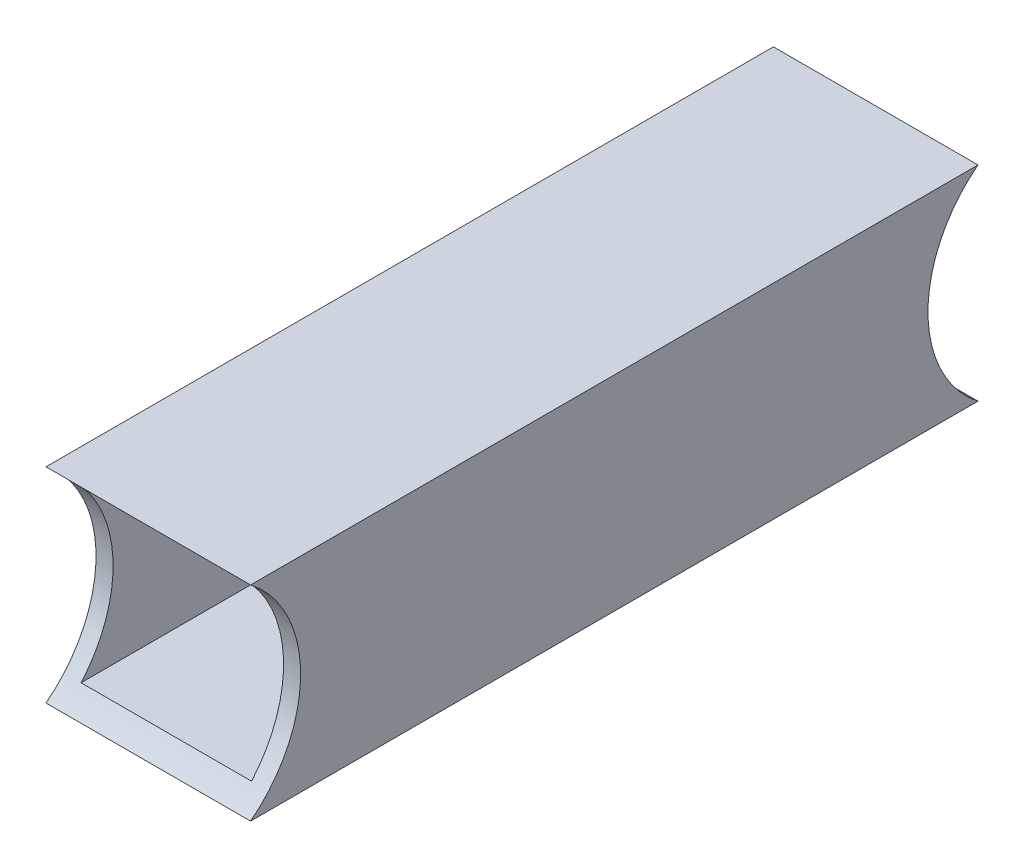
ISO-10303-21;
HEADER;
FILE_DESCRIPTION(('STEP AP214'),'2;1');
FILE_NAME('part.step','',(''),(''),'','','');
FILE_SCHEMA(('AUTOMOTIVE_DESIGN { 1 0 10303 214 1 1 1 1 }'));
ENDSEC;
DATA;
#1=APPLICATION_CONTEXT('core data for automotive mechanical design processes');
#2=APPLICATION_PROTOCOL_DEFINITION('international standard','automotive_design',2000,#1);
#3=PRODUCT_CONTEXT('',#1,'mechanical');
#4=PRODUCT('Part','Part','',(#3));
#5=PRODUCT_RELATED_PRODUCT_CATEGORY('part','',(#4));
#6=PRODUCT_DEFINITION_FORMATION('','',#4);
#7=PRODUCT_DEFINITION_CONTEXT('part definition',#1,'design');
#8=PRODUCT_DEFINITION('design','',#6,#7);
#9=PRODUCT_DEFINITION_SHAPE('','',#8);
#10=(LENGTH_UNIT() NAMED_UNIT(*) SI_UNIT(.MILLI.,.METRE.));
#11=(NAMED_UNIT(*) PLANE_ANGLE_UNIT() SI_UNIT($,.RADIAN.));
#12=(NAMED_UNIT(*) SI_UNIT($,.STERADIAN.) SOLID_ANGLE_UNIT());
#13=UNCERTAINTY_MEASURE_WITH_UNIT(LENGTH_MEASURE(1.E-05),#10,'distance_accuracy_value','');
#14=(GEOMETRIC_REPRESENTATION_CONTEXT(3) GLOBAL_UNCERTAINTY_ASSIGNED_CONTEXT((#13)) GLOBAL_UNIT_ASSIGNED_CONTEXT((#10,
#11,#12)) REPRESENTATION_CONTEXT('',''));
#15=CARTESIAN_POINT('',(0.,0.,0.));
#16=DIRECTION('',(0.,0.,1.));
#17=DIRECTION('',(1.,0.,0.));
#18=AXIS2_PLACEMENT_3D('',#15,#16,#17);
#19=CARTESIAN_POINT('',(38.1,19.05,-165.1));
#20=DIRECTION('',(-1.,0.,0.));
#21=DIRECTION('',(0.,0.,1.));
#22=AXIS2_PLACEMENT_3D('',#19,#20,#21);
#23=CYLINDRICAL_SURFACE('',#22,24.13);
#24=DIRECTION('',(-1.,0.,0.));
#25=VECTOR('',#24,1.);
#26=CARTESIAN_POINT('',(38.1,34.925,-146.927458213007));
#27=LINE('',#26,#25);
#28=CARTESIAN_POINT('',(3.175,34.925,-146.927458213007));
#29=VERTEX_POINT('',#28);
#30=CARTESIAN_POINT('',(34.925,34.925,-146.927458213007));
#31=VERTEX_POINT('',#30);
#32=EDGE_CURVE('E106',#29,#31,#27,.F.);
#33=ORIENTED_EDGE('',*,*,#32,.F.);
#34=CARTESIAN_POINT('',(3.175,19.05,-165.1));
#35=DIRECTION('',(-1.,0.,0.));
#36=DIRECTION('',(0.,0.,1.));
#37=AXIS2_PLACEMENT_3D('',#34,#35,#36);
#38=CIRCLE('',#37,24.13);
#39=CARTESIAN_POINT('',(3.175,3.175,-146.927458213007));
#40=VERTEX_POINT('',#39);
#41=EDGE_CURVE('E95',#40,#29,#38,.T.);
#42=ORIENTED_EDGE('',*,*,#41,.F.);
#43=DIRECTION('',(-1.,0.,0.));
#44=VECTOR('',#43,1.);
#45=CARTESIAN_POINT('',(38.1,3.175,-146.927458213007));
#46=LINE('',#45,#44);
#47=CARTESIAN_POINT('',(34.925,3.175,-146.927458213007));
#48=VERTEX_POINT('',#47);
#49=EDGE_CURVE('E100',#48,#40,#46,.T.);
#50=ORIENTED_EDGE('',*,*,#49,.F.);
#51=CARTESIAN_POINT('',(34.925,19.05,-165.1));
#52=DIRECTION('',(1.,0.,0.));
#53=DIRECTION('',(0.,0.,-1.));
#54=AXIS2_PLACEMENT_3D('',#51,#52,#53);
#55=CIRCLE('',#54,24.13);
#56=EDGE_CURVE('E113',#31,#48,#55,.T.);
#57=ORIENTED_EDGE('',*,*,#56,.F.);
#58=EDGE_LOOP('',(#33,#42,#50,#57));
#59=FACE_BOUND('',#58,.T.);
#60=CARTESIAN_POINT('',(0.,19.05,-165.1));
#61=DIRECTION('',(1.,0.,0.));
#62=DIRECTION('',(0.,0.,-1.));
#63=AXIS2_PLACEMENT_3D('',#60,#61,#62);
#64=CIRCLE('',#63,24.13);
#65=CARTESIAN_POINT('',(0.,38.1,-150.289382187093));
#66=VERTEX_POINT('',#65);
#67=CARTESIAN_POINT('',(0.,0.,-150.289382187093));
#68=VERTEX_POINT('',#67);
#69=EDGE_CURVE('E114',#66,#68,#64,.T.);
#70=ORIENTED_EDGE('',*,*,#69,.F.);
#71=DIRECTION('',(-1.,0.,0.));
#72=VECTOR('',#71,1.);
#73=CARTESIAN_POINT('',(38.1,38.1,-150.289382187093));
#74=LINE('',#73,#72);
#75=CARTESIAN_POINT('',(38.1,38.1,-150.289382187093));
#76=VERTEX_POINT('',#75);
#77=EDGE_CURVE('E147',#76,#66,#74,.T.);
#78=ORIENTED_EDGE('',*,*,#77,.F.);
#79=CARTESIAN_POINT('',(38.1,19.05,-165.1));
#80=DIRECTION('',(1.,0.,0.));
#81=DIRECTION('',(0.,0.,-1.));
#82=AXIS2_PLACEMENT_3D('',#79,#80,#81);
#83=CIRCLE('',#82,24.13);
#84=CARTESIAN_POINT('',(38.1,0.,-150.289382187093));
#85=VERTEX_POINT('',#84);
#86=EDGE_CURVE('E122',#76,#85,#83,.T.);
#87=ORIENTED_EDGE('',*,*,#86,.T.);
#88=DIRECTION('',(-1.,0.,0.));
#89=VECTOR('',#88,1.);
#90=CARTESIAN_POINT('',(38.1,0.,-150.289382187093));
#91=LINE('',#90,#89);
#92=EDGE_CURVE('E133',#85,#68,#91,.T.);
#93=ORIENTED_EDGE('',*,*,#92,.T.);
#94=EDGE_LOOP('',(#70,#78,#87,#93));
#95=FACE_BOUND('',#94,.T.);
#96=ADVANCED_FACE('F35',(#59,#95),#23,.F.);
#97=CARTESIAN_POINT('',(38.1,38.1,0.));
#98=DIRECTION('',(0.,1.,0.));
#99=DIRECTION('',(0.,0.,1.));
#100=AXIS2_PLACEMENT_3D('',#97,#98,#99);
#101=PLANE('',#100);
#102=DIRECTION('',(0.,0.,-1.));
#103=VECTOR('',#102,1.);
#104=CARTESIAN_POINT('',(0.,38.1,0.));
#105=LINE('',#104,#103);
#106=CARTESIAN_POINT('',(0.,38.1,-14.8106178129071));
#107=VERTEX_POINT('',#106);
#108=EDGE_CURVE('E117',#107,#66,#105,.T.);
#109=ORIENTED_EDGE('',*,*,#108,.F.);
#110=DIRECTION('',(-1.,0.,0.));
#111=VECTOR('',#110,1.);
#112=CARTESIAN_POINT('',(38.1,38.1,-14.8106178129071));
#113=LINE('',#112,#111);
#114=CARTESIAN_POINT('',(38.1,38.1,-14.8106178129071));
#115=VERTEX_POINT('',#114);
#116=EDGE_CURVE('E145',#115,#107,#113,.T.);
#117=ORIENTED_EDGE('',*,*,#116,.F.);
#118=DIRECTION('',(0.,0.,-1.));
#119=VECTOR('',#118,1.);
#120=CARTESIAN_POINT('',(38.1,38.1,0.));
#121=LINE('',#120,#119);
#122=EDGE_CURVE('E125',#115,#76,#121,.T.);
#123=ORIENTED_EDGE('',*,*,#122,.T.);
#124=ORIENTED_EDGE('',*,*,#77,.T.);
#125=EDGE_LOOP('',(#109,#117,#123,#124));
#126=FACE_BOUND('',#125,.T.);
#127=ADVANCED_FACE('F176',(#126),#101,.T.);
#128=CARTESIAN_POINT('',(38.1,19.05,0.));
#129=DIRECTION('',(-1.,0.,0.));
#130=DIRECTION('',(0.,0.,1.));
#131=AXIS2_PLACEMENT_3D('',#128,#129,#130);
#132=CYLINDRICAL_SURFACE('',#131,24.13);
#133=DIRECTION('',(-1.,0.,0.));
#134=VECTOR('',#133,1.);
#135=CARTESIAN_POINT('',(38.1,34.925,-18.1725417869928));
#136=LINE('',#135,#134);
#137=CARTESIAN_POINT('',(34.925,34.925,-18.1725417869928));
#138=VERTEX_POINT('',#137);
#139=CARTESIAN_POINT('',(3.175,34.925,-18.1725417869928));
#140=VERTEX_POINT('',#139);
#141=EDGE_CURVE('E11',#138,#140,#136,.T.);
#142=ORIENTED_EDGE('',*,*,#141,.F.);
#143=CARTESIAN_POINT('',(34.925,19.05,0.));
#144=DIRECTION('',(1.,0.,0.));
#145=DIRECTION('',(0.,0.,-1.));
#146=AXIS2_PLACEMENT_3D('',#143,#144,#145);
#147=CIRCLE('',#146,24.13);
#148=CARTESIAN_POINT('',(34.925,3.175,-18.1725417869928));
#149=VERTEX_POINT('',#148);
#150=EDGE_CURVE('E42',#149,#138,#147,.T.);
#151=ORIENTED_EDGE('',*,*,#150,.F.);
#152=DIRECTION('',(-1.,0.,0.));
#153=VECTOR('',#152,1.);
#154=CARTESIAN_POINT('',(38.1,3.175,-18.1725417869928));
#155=LINE('',#154,#153);
#156=CARTESIAN_POINT('',(3.175,3.175,-18.1725417869928));
#157=VERTEX_POINT('',#156);
#158=EDGE_CURVE('E151',#157,#149,#155,.F.);
#159=ORIENTED_EDGE('',*,*,#158,.F.);
#160=CARTESIAN_POINT('',(3.175,19.05,0.));
#161=DIRECTION('',(-1.,0.,0.));
#162=DIRECTION('',(0.,0.,1.));
#163=AXIS2_PLACEMENT_3D('',#160,#161,#162);
#164=CIRCLE('',#163,24.13);
#165=EDGE_CURVE('E149',#140,#157,#164,.T.);
#166=ORIENTED_EDGE('',*,*,#165,.F.);
#167=EDGE_LOOP('',(#142,#151,#159,#166));
#168=FACE_BOUND('',#167,.T.);
#169=CARTESIAN_POINT('',(0.,19.05,0.));
#170=DIRECTION('',(1.,0.,0.));
#171=DIRECTION('',(0.,0.,-1.));
#172=AXIS2_PLACEMENT_3D('',#169,#170,#171);
#173=CIRCLE('',#172,24.13);
#174=CARTESIAN_POINT('',(0.,0.,-14.8106178129071));
#175=VERTEX_POINT('',#174);
#176=EDGE_CURVE('E137',#175,#107,#173,.T.);
#177=ORIENTED_EDGE('',*,*,#176,.F.);
#178=DIRECTION('',(-1.,0.,0.));
#179=VECTOR('',#178,1.);
#180=CARTESIAN_POINT('',(38.1,0.,-14.8106178129071));
#181=LINE('',#180,#179);
#182=CARTESIAN_POINT('',(38.1,0.,-14.8106178129071));
#183=VERTEX_POINT('',#182);
#184=EDGE_CURVE('E143',#183,#175,#181,.T.);
#185=ORIENTED_EDGE('',*,*,#184,.F.);
#186=CARTESIAN_POINT('',(38.1,19.05,0.));
#187=DIRECTION('',(1.,0.,0.));
#188=DIRECTION('',(0.,0.,-1.));
#189=AXIS2_PLACEMENT_3D('',#186,#187,#188);
#190=CIRCLE('',#189,24.13);
#191=EDGE_CURVE('E129',#183,#115,#190,.T.);
#192=ORIENTED_EDGE('',*,*,#191,.T.);
#193=ORIENTED_EDGE('',*,*,#116,.T.);
#194=EDGE_LOOP('',(#177,#185,#192,#193));
#195=FACE_BOUND('',#194,.T.);
#196=ADVANCED_FACE('F161',(#168,#195),#132,.F.);
#197=CARTESIAN_POINT('',(38.1,0.,0.));
#198=DIRECTION('',(0.,1.,0.));
#199=DIRECTION('',(0.,0.,1.));
#200=AXIS2_PLACEMENT_3D('',#197,#198,#199);
#201=PLANE('',#200);
#202=DIRECTION('',(0.,0.,-1.));
#203=VECTOR('',#202,1.);
#204=CARTESIAN_POINT('',(0.,0.,0.));
#205=LINE('',#204,#203);
#206=EDGE_CURVE('E126',#175,#68,#205,.T.);
#207=ORIENTED_EDGE('',*,*,#206,.T.);
#208=ORIENTED_EDGE('',*,*,#92,.F.);
#209=DIRECTION('',(0.,0.,-1.));
#210=VECTOR('',#209,1.);
#211=CARTESIAN_POINT('',(38.1,0.,0.));
#212=LINE('',#211,#210);
#213=EDGE_CURVE('E132',#183,#85,#212,.T.);
#214=ORIENTED_EDGE('',*,*,#213,.F.);
#215=ORIENTED_EDGE('',*,*,#184,.T.);
#216=EDGE_LOOP('',(#207,#208,#214,#215));
#217=FACE_BOUND('',#216,.T.);
#218=ADVANCED_FACE('F184',(#217),#201,.F.);
#219=CARTESIAN_POINT('',(38.1,0.,0.));
#220=DIRECTION('',(1.,0.,0.));
#221=DIRECTION('',(0.,0.,-1.));
#222=AXIS2_PLACEMENT_3D('',#219,#220,#221);
#223=PLANE('',#222);
#224=ORIENTED_EDGE('',*,*,#86,.F.);
#225=ORIENTED_EDGE('',*,*,#122,.F.);
#226=ORIENTED_EDGE('',*,*,#191,.F.);
#227=ORIENTED_EDGE('',*,*,#213,.T.);
#228=EDGE_LOOP('',(#224,#225,#226,#227));
#229=FACE_BOUND('',#228,.T.);
#230=ADVANCED_FACE('F190',(#229),#223,.T.);
#231=CARTESIAN_POINT('',(0.,0.,0.));
#232=DIRECTION('',(1.,0.,0.));
#233=DIRECTION('',(0.,0.,-1.));
#234=AXIS2_PLACEMENT_3D('',#231,#232,#233);
#235=PLANE('',#234);
#236=ORIENTED_EDGE('',*,*,#69,.T.);
#237=ORIENTED_EDGE('',*,*,#206,.F.);
#238=ORIENTED_EDGE('',*,*,#176,.T.);
#239=ORIENTED_EDGE('',*,*,#108,.T.);
#240=EDGE_LOOP('',(#236,#237,#238,#239));
#241=FACE_BOUND('',#240,.T.);
#242=ADVANCED_FACE('F192',(#241),#235,.F.);
#243=CARTESIAN_POINT('',(34.925,34.925,-150.289382187093));
#244=DIRECTION('',(0.,1.,0.));
#245=DIRECTION('',(0.,0.,1.));
#246=AXIS2_PLACEMENT_3D('',#243,#244,#245);
#247=PLANE('',#246);
#248=ORIENTED_EDGE('',*,*,#32,.T.);
#249=DIRECTION('',(0.,0.,1.));
#250=VECTOR('',#249,1.);
#251=CARTESIAN_POINT('',(34.925,34.925,-150.289382187093));
#252=LINE('',#251,#250);
#253=EDGE_CURVE('E101',#31,#138,#252,.T.);
#254=ORIENTED_EDGE('',*,*,#253,.T.);
#255=ORIENTED_EDGE('',*,*,#141,.T.);
#256=DIRECTION('',(0.,0.,1.));
#257=VECTOR('',#256,1.);
#258=CARTESIAN_POINT('',(3.175,34.925,-150.289382187093));
#259=LINE('',#258,#257);
#260=EDGE_CURVE('E54',#29,#140,#259,.T.);
#261=ORIENTED_EDGE('',*,*,#260,.F.);
#262=EDGE_LOOP('',(#248,#254,#255,#261));
#263=FACE_BOUND('',#262,.T.);
#264=ADVANCED_FACE('F104',(#263),#247,.F.);
#265=CARTESIAN_POINT('',(34.925,3.175,-150.289382187093));
#266=DIRECTION('',(1.,0.,0.));
#267=DIRECTION('',(0.,0.,-1.));
#268=AXIS2_PLACEMENT_3D('',#265,#266,#267);
#269=PLANE('',#268);
#270=ORIENTED_EDGE('',*,*,#56,.T.);
#271=DIRECTION('',(0.,0.,1.));
#272=VECTOR('',#271,1.);
#273=CARTESIAN_POINT('',(34.925,3.175,-150.289382187093));
#274=LINE('',#273,#272);
#275=EDGE_CURVE('E157',#48,#149,#274,.T.);
#276=ORIENTED_EDGE('',*,*,#275,.T.);
#277=ORIENTED_EDGE('',*,*,#150,.T.);
#278=ORIENTED_EDGE('',*,*,#253,.F.);
#279=EDGE_LOOP('',(#270,#276,#277,#278));
#280=FACE_BOUND('',#279,.T.);
#281=ADVANCED_FACE('F155',(#280),#269,.F.);
#282=CARTESIAN_POINT('',(3.175,3.175,-150.289382187093));
#283=DIRECTION('',(0.,-1.,0.));
#284=DIRECTION('',(0.,0.,-1.));
#285=AXIS2_PLACEMENT_3D('',#282,#283,#284);
#286=PLANE('',#285);
#287=ORIENTED_EDGE('',*,*,#49,.T.);
#288=DIRECTION('',(0.,0.,1.));
#289=VECTOR('',#288,1.);
#290=CARTESIAN_POINT('',(3.175,3.175,-150.289382187093));
#291=LINE('',#290,#289);
#292=EDGE_CURVE('E49',#40,#157,#291,.T.);
#293=ORIENTED_EDGE('',*,*,#292,.T.);
#294=ORIENTED_EDGE('',*,*,#158,.T.);
#295=ORIENTED_EDGE('',*,*,#275,.F.);
#296=EDGE_LOOP('',(#287,#293,#294,#295));
#297=FACE_BOUND('',#296,.T.);
#298=ADVANCED_FACE('F164',(#297),#286,.F.);
#299=CARTESIAN_POINT('',(3.175,34.925,-150.289382187093));
#300=DIRECTION('',(-1.,0.,0.));
#301=DIRECTION('',(0.,0.,1.));
#302=AXIS2_PLACEMENT_3D('',#299,#300,#301);
#303=PLANE('',#302);
#304=ORIENTED_EDGE('',*,*,#41,.T.);
#305=ORIENTED_EDGE('',*,*,#260,.T.);
#306=ORIENTED_EDGE('',*,*,#165,.T.);
#307=ORIENTED_EDGE('',*,*,#292,.F.);
#308=EDGE_LOOP('',(#304,#305,#306,#307));
#309=FACE_BOUND('',#308,.T.);
#310=ADVANCED_FACE('F96',(#309),#303,.F.);
#311=CLOSED_SHELL('',(#96,#127,#196,#218,#230,#242,#264,#281,#298,#310));
#312=MANIFOLD_SOLID_BREP('B2',#311);
#313=ADVANCED_BREP_SHAPE_REPRESENTATION('',(#18,#312),#14);
#314=SHAPE_DEFINITION_REPRESENTATION(#9,#313);
ENDSEC;
END-ISO-10303-21;
